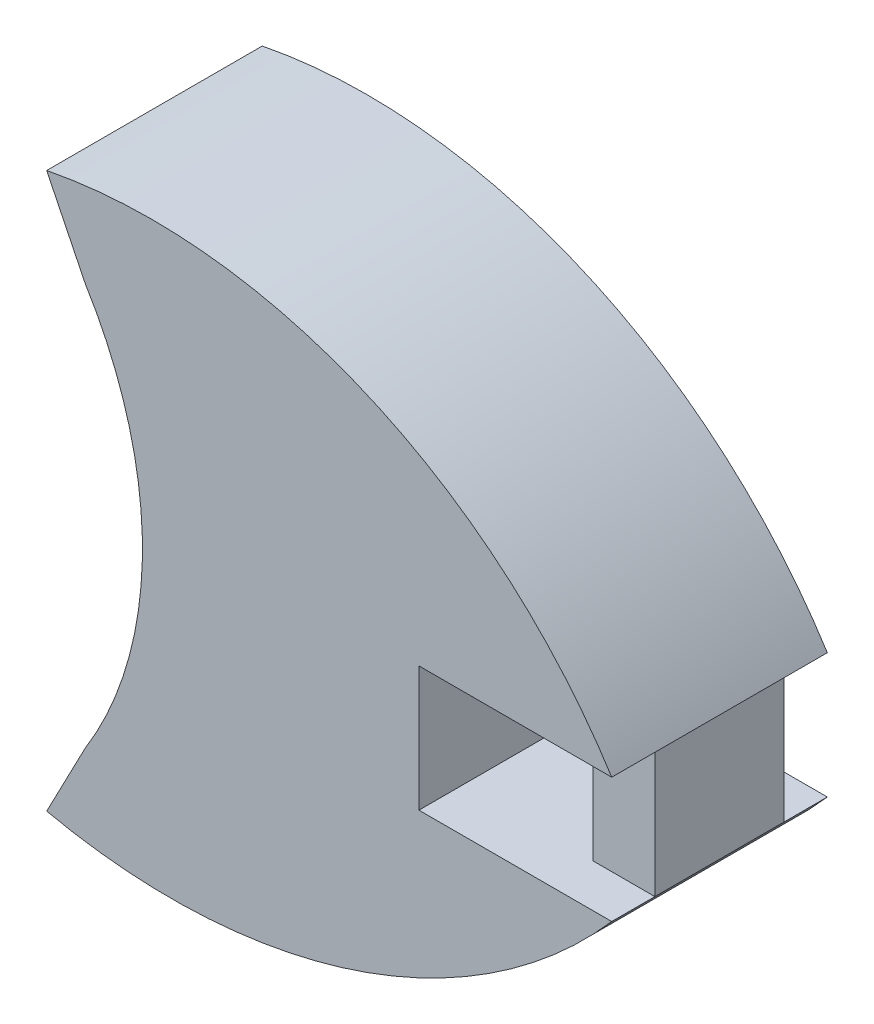
ISO-10303-21;
HEADER;
FILE_DESCRIPTION(('STEP AP214'),'2;1');
FILE_NAME('part.step','',(''),(''),'','','');
FILE_SCHEMA(('AUTOMOTIVE_DESIGN { 1 0 10303 214 1 1 1 1 }'));
ENDSEC;
DATA;
#1=APPLICATION_CONTEXT('core data for automotive mechanical design processes');
#2=APPLICATION_PROTOCOL_DEFINITION('international standard','automotive_design',2000,#1);
#3=PRODUCT_CONTEXT('',#1,'mechanical');
#4=PRODUCT('Part','Part','',(#3));
#5=PRODUCT_RELATED_PRODUCT_CATEGORY('part','',(#4));
#6=PRODUCT_DEFINITION_FORMATION('','',#4);
#7=PRODUCT_DEFINITION_CONTEXT('part definition',#1,'design');
#8=PRODUCT_DEFINITION('design','',#6,#7);
#9=PRODUCT_DEFINITION_SHAPE('','',#8);
#10=(LENGTH_UNIT() NAMED_UNIT(*) SI_UNIT(.MILLI.,.METRE.));
#11=(NAMED_UNIT(*) PLANE_ANGLE_UNIT() SI_UNIT($,.RADIAN.));
#12=(NAMED_UNIT(*) SI_UNIT($,.STERADIAN.) SOLID_ANGLE_UNIT());
#13=UNCERTAINTY_MEASURE_WITH_UNIT(LENGTH_MEASURE(1.E-05),#10,'distance_accuracy_value','');
#14=(GEOMETRIC_REPRESENTATION_CONTEXT(3) GLOBAL_UNCERTAINTY_ASSIGNED_CONTEXT((#13)) GLOBAL_UNIT_ASSIGNED_CONTEXT((#10,
#11,#12)) REPRESENTATION_CONTEXT('',''));
#15=CARTESIAN_POINT('',(0.,0.,0.));
#16=DIRECTION('',(0.,0.,1.));
#17=DIRECTION('',(1.,0.,0.));
#18=AXIS2_PLACEMENT_3D('',#15,#16,#17);
#19=CARTESIAN_POINT('',(0.,0.,10.));
#20=DIRECTION('',(-1.,0.,0.));
#21=DIRECTION('',(0.,0.,1.));
#22=AXIS2_PLACEMENT_3D('',#19,#20,#21);
#23=PLANE('',#22);
#24=DIRECTION('',(0.,-1.,0.));
#25=VECTOR('',#24,1.);
#26=CARTESIAN_POINT('',(0.,0.,2.));
#27=LINE('',#26,#25);
#28=CARTESIAN_POINT('',(0.,0.,2.));
#29=VERTEX_POINT('',#28);
#30=CARTESIAN_POINT('',(0.,-5.79606282895322,2.));
#31=VERTEX_POINT('',#30);
#32=EDGE_CURVE('E215',#29,#31,#27,.T.);
#33=ORIENTED_EDGE('',*,*,#32,.F.);
#34=DIRECTION('',(0.,0.,-1.));
#35=VECTOR('',#34,1.);
#36=CARTESIAN_POINT('',(0.,0.,10.));
#37=LINE('',#36,#35);
#38=CARTESIAN_POINT('',(0.,0.,8.));
#39=VERTEX_POINT('',#38);
#40=EDGE_CURVE('E42',#39,#29,#37,.T.);
#41=ORIENTED_EDGE('',*,*,#40,.F.);
#42=DIRECTION('',(0.,1.,0.));
#43=VECTOR('',#42,1.);
#44=CARTESIAN_POINT('',(0.,0.,8.));
#45=LINE('',#44,#43);
#46=CARTESIAN_POINT('',(0.,-5.79606282895322,8.));
#47=VERTEX_POINT('',#46);
#48=EDGE_CURVE('E232',#47,#39,#45,.T.);
#49=ORIENTED_EDGE('',*,*,#48,.F.);
#50=DIRECTION('',(0.,0.,-1.));
#51=VECTOR('',#50,1.);
#52=CARTESIAN_POINT('',(0.,-5.79606282895322,10.));
#53=LINE('',#52,#51);
#54=EDGE_CURVE('E166',#47,#31,#53,.T.);
#55=ORIENTED_EDGE('',*,*,#54,.T.);
#56=EDGE_LOOP('',(#33,#41,#49,#55));
#57=FACE_BOUND('',#56,.T.);
#58=ADVANCED_FACE('F33',(#57),#23,.F.);
#59=CARTESIAN_POINT('',(-2.8595506181311,0.,10.));
#60=DIRECTION('',(1.,0.,0.));
#61=DIRECTION('',(0.,0.,-1.));
#62=AXIS2_PLACEMENT_3D('',#59,#60,#61);
#63=PLANE('',#62);
#64=DIRECTION('',(0.,1.,0.));
#65=VECTOR('',#64,1.);
#66=CARTESIAN_POINT('',(-2.8595506181311,0.,2.));
#67=LINE('',#66,#65);
#68=CARTESIAN_POINT('',(-2.8595506181311,-5.79606282895322,2.));
#69=VERTEX_POINT('',#68);
#70=CARTESIAN_POINT('',(-2.8595506181311,0.,2.));
#71=VERTEX_POINT('',#70);
#72=EDGE_CURVE('E209',#69,#71,#67,.T.);
#73=ORIENTED_EDGE('',*,*,#72,.F.);
#74=DIRECTION('',(0.,0.,-1.));
#75=VECTOR('',#74,1.);
#76=CARTESIAN_POINT('',(-2.8595506181311,-5.79606282895322,10.));
#77=LINE('',#76,#75);
#78=CARTESIAN_POINT('',(-2.8595506181311,-5.79606282895322,8.));
#79=VERTEX_POINT('',#78);
#80=EDGE_CURVE('E223',#79,#69,#77,.T.);
#81=ORIENTED_EDGE('',*,*,#80,.F.);
#82=DIRECTION('',(0.,-1.,0.));
#83=VECTOR('',#82,1.);
#84=CARTESIAN_POINT('',(-2.8595506181311,0.,8.));
#85=LINE('',#84,#83);
#86=CARTESIAN_POINT('',(-2.8595506181311,0.,8.));
#87=VERTEX_POINT('',#86);
#88=EDGE_CURVE('E244',#87,#79,#85,.T.);
#89=ORIENTED_EDGE('',*,*,#88,.F.);
#90=DIRECTION('',(0.,0.,-1.));
#91=VECTOR('',#90,1.);
#92=CARTESIAN_POINT('',(-2.8595506181311,0.,10.));
#93=LINE('',#92,#91);
#94=EDGE_CURVE('E146',#87,#71,#93,.T.);
#95=ORIENTED_EDGE('',*,*,#94,.T.);
#96=EDGE_LOOP('',(#73,#81,#89,#95));
#97=FACE_BOUND('',#96,.T.);
#98=ADVANCED_FACE('F222',(#97),#63,.F.);
#99=CARTESIAN_POINT('',(0.,0.,10.));
#100=DIRECTION('',(0.,-1.,0.));
#101=DIRECTION('',(0.,0.,-1.));
#102=AXIS2_PLACEMENT_3D('',#99,#100,#101);
#103=PLANE('',#102);
#104=DIRECTION('',(-1.,0.,0.));
#105=VECTOR('',#104,1.);
#106=CARTESIAN_POINT('',(0.,0.,0.));
#107=LINE('',#106,#105);
#108=CARTESIAN_POINT('',(0.,0.,0.));
#109=VERTEX_POINT('',#108);
#110=CARTESIAN_POINT('',(-8.94249693609927,0.,0.));
#111=VERTEX_POINT('',#110);
#112=EDGE_CURVE('E143',#109,#111,#107,.T.);
#113=ORIENTED_EDGE('',*,*,#112,.F.);
#114=DIRECTION('',(0.,0.,-1.));
#115=VECTOR('',#114,1.);
#116=CARTESIAN_POINT('',(0.,0.,2.));
#117=LINE('',#116,#115);
#118=EDGE_CURVE('E203',#29,#109,#117,.T.);
#119=ORIENTED_EDGE('',*,*,#118,.F.);
#120=DIRECTION('',(1.,0.,0.));
#121=VECTOR('',#120,1.);
#122=CARTESIAN_POINT('',(0.,0.,2.));
#123=LINE('',#122,#121);
#124=EDGE_CURVE('E225',#71,#29,#123,.T.);
#125=ORIENTED_EDGE('',*,*,#124,.F.);
#126=ORIENTED_EDGE('',*,*,#94,.F.);
#127=DIRECTION('',(-1.,0.,0.));
#128=VECTOR('',#127,1.);
#129=CARTESIAN_POINT('',(-2.8595506181311,0.,8.));
#130=LINE('',#129,#128);
#131=EDGE_CURVE('E50',#39,#87,#130,.T.);
#132=ORIENTED_EDGE('',*,*,#131,.F.);
#133=CARTESIAN_POINT('',(0.,0.,10.));
#134=VERTEX_POINT('',#133);
#135=EDGE_CURVE('E11',#134,#39,#37,.T.);
#136=ORIENTED_EDGE('',*,*,#135,.F.);
#137=DIRECTION('',(-1.,0.,0.));
#138=VECTOR('',#137,1.);
#139=CARTESIAN_POINT('',(0.,0.,10.));
#140=LINE('',#139,#138);
#141=CARTESIAN_POINT('',(-8.94249693609927,0.,10.));
#142=VERTEX_POINT('',#141);
#143=EDGE_CURVE('E97',#134,#142,#140,.T.);
#144=ORIENTED_EDGE('',*,*,#143,.T.);
#145=DIRECTION('',(0.,0.,-1.));
#146=VECTOR('',#145,1.);
#147=CARTESIAN_POINT('',(-8.94249693609927,0.,10.));
#148=LINE('',#147,#146);
#149=EDGE_CURVE('E37',#142,#111,#148,.T.);
#150=ORIENTED_EDGE('',*,*,#149,.T.);
#151=EDGE_LOOP('',(#113,#119,#125,#126,#132,#136,#144,#150));
#152=FACE_BOUND('',#151,.T.);
#153=ADVANCED_FACE('F35',(#152),#103,.T.);
#154=CARTESIAN_POINT('',(-8.94249693609927,-5.79606282895323,10.));
#155=DIRECTION('',(0.,1.,0.));
#156=DIRECTION('',(0.,0.,1.));
#157=AXIS2_PLACEMENT_3D('',#154,#155,#156);
#158=PLANE('',#157);
#159=DIRECTION('',(1.,0.,0.));
#160=VECTOR('',#159,1.);
#161=CARTESIAN_POINT('',(-8.94249693609927,-5.79606282895323,10.));
#162=LINE('',#161,#160);
#163=CARTESIAN_POINT('',(-8.94249693609927,-5.79606282895323,10.));
#164=VERTEX_POINT('',#163);
#165=CARTESIAN_POINT('',(0.,-5.79606282895322,10.));
#166=VERTEX_POINT('',#165);
#167=EDGE_CURVE('E137',#164,#166,#162,.T.);
#168=ORIENTED_EDGE('',*,*,#167,.T.);
#169=EDGE_CURVE('E164',#166,#47,#53,.T.);
#170=ORIENTED_EDGE('',*,*,#169,.T.);
#171=DIRECTION('',(1.,0.,0.));
#172=VECTOR('',#171,1.);
#173=CARTESIAN_POINT('',(-2.8595506181311,-5.79606282895322,8.));
#174=LINE('',#173,#172);
#175=EDGE_CURVE('E229',#79,#47,#174,.T.);
#176=ORIENTED_EDGE('',*,*,#175,.F.);
#177=ORIENTED_EDGE('',*,*,#80,.T.);
#178=DIRECTION('',(-1.,0.,0.));
#179=VECTOR('',#178,1.);
#180=CARTESIAN_POINT('',(0.,-5.79606282895322,2.));
#181=LINE('',#180,#179);
#182=EDGE_CURVE('E212',#31,#69,#181,.T.);
#183=ORIENTED_EDGE('',*,*,#182,.F.);
#184=DIRECTION('',(0.,0.,-1.));
#185=VECTOR('',#184,1.);
#186=CARTESIAN_POINT('',(0.,-5.79606282895322,2.));
#187=LINE('',#186,#185);
#188=CARTESIAN_POINT('',(0.,-5.79606282895322,0.));
#189=VERTEX_POINT('',#188);
#190=EDGE_CURVE('E251',#31,#189,#187,.T.);
#191=ORIENTED_EDGE('',*,*,#190,.T.);
#192=DIRECTION('',(1.,0.,0.));
#193=VECTOR('',#192,1.);
#194=CARTESIAN_POINT('',(-8.94249693609927,-5.79606282895323,0.));
#195=LINE('',#194,#193);
#196=CARTESIAN_POINT('',(-8.94249693609927,-5.79606282895323,0.));
#197=VERTEX_POINT('',#196);
#198=EDGE_CURVE('E149',#197,#189,#195,.T.);
#199=ORIENTED_EDGE('',*,*,#198,.F.);
#200=DIRECTION('',(0.,0.,-1.));
#201=VECTOR('',#200,1.);
#202=CARTESIAN_POINT('',(-8.94249693609927,-5.79606282895323,10.));
#203=LINE('',#202,#201);
#204=EDGE_CURVE('E167',#164,#197,#203,.T.);
#205=ORIENTED_EDGE('',*,*,#204,.F.);
#206=EDGE_LOOP('',(#168,#170,#176,#177,#183,#191,#199,#205));
#207=FACE_BOUND('',#206,.T.);
#208=ADVANCED_FACE('F227',(#207),#158,.T.);
#209=CARTESIAN_POINT('',(-21.327436511026,-13.495667326703,10.));
#210=DIRECTION('',(0.,0.,-1.));
#211=DIRECTION('',(-1.,0.,0.));
#212=AXIS2_PLACEMENT_3D('',#209,#210,#211);
#213=CYLINDRICAL_SURFACE('',#212,25.2387120258718);
#214=CARTESIAN_POINT('',(-21.327436511026,-13.495667326703,0.));
#215=DIRECTION('',(0.,0.,1.));
#216=DIRECTION('',(1.,0.,0.));
#217=AXIS2_PLACEMENT_3D('',#214,#215,#216);
#218=CIRCLE('',#217,25.2387120258718);
#219=CARTESIAN_POINT('',(-26.2092868313812,11.2664029052976,0.));
#220=VERTEX_POINT('',#219);
#221=EDGE_CURVE('E89',#109,#220,#218,.T.);
#222=ORIENTED_EDGE('',*,*,#221,.T.);
#223=DIRECTION('',(0.,0.,-1.));
#224=VECTOR('',#223,1.);
#225=CARTESIAN_POINT('',(-26.2092868313812,11.2664029052976,10.));
#226=LINE('',#225,#224);
#227=CARTESIAN_POINT('',(-26.2092868313812,11.2664029052976,10.));
#228=VERTEX_POINT('',#227);
#229=EDGE_CURVE('E160',#228,#220,#226,.T.);
#230=ORIENTED_EDGE('',*,*,#229,.F.);
#231=CARTESIAN_POINT('',(-21.327436511026,-13.495667326703,10.));
#232=DIRECTION('',(0.,0.,1.));
#233=DIRECTION('',(1.,0.,0.));
#234=AXIS2_PLACEMENT_3D('',#231,#232,#233);
#235=CIRCLE('',#234,25.2387120258718);
#236=EDGE_CURVE('E59',#134,#228,#235,.T.);
#237=ORIENTED_EDGE('',*,*,#236,.F.);
#238=ORIENTED_EDGE('',*,*,#135,.T.);
#239=ORIENTED_EDGE('',*,*,#40,.T.);
#240=ORIENTED_EDGE('',*,*,#118,.T.);
#241=EDGE_LOOP('',(#222,#230,#237,#238,#239,#240));
#242=FACE_BOUND('',#241,.T.);
#243=ADVANCED_FACE('F255',(#242),#213,.T.);
#244=CARTESIAN_POINT('',(-26.2092868313812,11.2664029052976,10.));
#245=DIRECTION('',(0.898062707987213,0.439867448810064,0.));
#246=DIRECTION('',(-0.439867448810064,0.898062707987213,0.));
#247=AXIS2_PLACEMENT_3D('',#244,#245,#246);
#248=PLANE('',#247);
#249=DIRECTION('',(0.439867448810064,-0.898062707987213,0.));
#250=VECTOR('',#249,1.);
#251=CARTESIAN_POINT('',(-26.2092868313812,11.2664029052976,0.));
#252=LINE('',#251,#250);
#253=CARTESIAN_POINT('',(-24.4189653749276,7.6111632650381,0.));
#254=VERTEX_POINT('',#253);
#255=EDGE_CURVE('E157',#220,#254,#252,.T.);
#256=ORIENTED_EDGE('',*,*,#255,.T.);
#257=DIRECTION('',(0.,0.,-1.));
#258=VECTOR('',#257,1.);
#259=CARTESIAN_POINT('',(-24.4189653749276,7.6111632650381,10.));
#260=LINE('',#259,#258);
#261=CARTESIAN_POINT('',(-24.4189653749276,7.6111632650381,10.));
#262=VERTEX_POINT('',#261);
#263=EDGE_CURVE('E131',#262,#254,#260,.T.);
#264=ORIENTED_EDGE('',*,*,#263,.F.);
#265=DIRECTION('',(0.439867448810064,-0.898062707987213,0.));
#266=VECTOR('',#265,1.);
#267=CARTESIAN_POINT('',(-26.2092868313812,11.2664029052976,10.));
#268=LINE('',#267,#266);
#269=EDGE_CURVE('E118',#228,#262,#268,.T.);
#270=ORIENTED_EDGE('',*,*,#269,.F.);
#271=ORIENTED_EDGE('',*,*,#229,.T.);
#272=EDGE_LOOP('',(#256,#264,#270,#271));
#273=FACE_BOUND('',#272,.T.);
#274=ADVANCED_FACE('F257',(#273),#248,.F.);
#275=CARTESIAN_POINT('',(-39.4875043000791,-1.71342765399132,10.));
#276=DIRECTION('',(0.,0.,-1.));
#277=DIRECTION('',(-1.,0.,0.));
#278=AXIS2_PLACEMENT_3D('',#275,#276,#277);
#279=CYLINDRICAL_SURFACE('',#278,17.7202951766062);
#280=CARTESIAN_POINT('',(-39.4875043000791,-1.71342765399132,0.));
#281=DIRECTION('',(0.,0.,-1.));
#282=DIRECTION('',(-1.,0.,0.));
#283=AXIS2_PLACEMENT_3D('',#280,#281,#282);
#284=CIRCLE('',#283,17.7202951766062);
#285=CARTESIAN_POINT('',(-24.4189653749276,-11.0380185730207,0.));
#286=VERTEX_POINT('',#285);
#287=EDGE_CURVE('E127',#254,#286,#284,.T.);
#288=ORIENTED_EDGE('',*,*,#287,.T.);
#289=DIRECTION('',(0.,0.,-1.));
#290=VECTOR('',#289,1.);
#291=CARTESIAN_POINT('',(-24.4189653749276,-11.0380185730207,10.));
#292=LINE('',#291,#290);
#293=CARTESIAN_POINT('',(-24.4189653749276,-11.0380185730207,10.));
#294=VERTEX_POINT('',#293);
#295=EDGE_CURVE('E124',#294,#286,#292,.T.);
#296=ORIENTED_EDGE('',*,*,#295,.F.);
#297=CARTESIAN_POINT('',(-39.4875043000791,-1.71342765399132,10.));
#298=DIRECTION('',(0.,0.,-1.));
#299=DIRECTION('',(-1.,0.,0.));
#300=AXIS2_PLACEMENT_3D('',#297,#298,#299);
#301=CIRCLE('',#300,17.7202951766062);
#302=EDGE_CURVE('E110',#262,#294,#301,.T.);
#303=ORIENTED_EDGE('',*,*,#302,.F.);
#304=ORIENTED_EDGE('',*,*,#263,.T.);
#305=EDGE_LOOP('',(#288,#296,#303,#304));
#306=FACE_BOUND('',#305,.T.);
#307=ADVANCED_FACE('F125',(#306),#279,.F.);
#308=CARTESIAN_POINT('',(-26.2092868313812,-14.4694680312236,10.));
#309=DIRECTION('',(-0.886584846165455,0.46256600669502,0.));
#310=DIRECTION('',(-0.46256600669502,-0.886584846165455,0.));
#311=AXIS2_PLACEMENT_3D('',#308,#309,#310);
#312=PLANE('',#311);
#313=DIRECTION('',(0.46256600669502,0.886584846165454,0.));
#314=VECTOR('',#313,1.);
#315=CARTESIAN_POINT('',(-26.2092868313812,-14.4694680312236,0.));
#316=LINE('',#315,#314);
#317=CARTESIAN_POINT('',(-26.2092868313812,-14.4694680312236,0.));
#318=VERTEX_POINT('',#317);
#319=EDGE_CURVE('E154',#318,#286,#316,.T.);
#320=ORIENTED_EDGE('',*,*,#319,.F.);
#321=DIRECTION('',(0.,0.,-1.));
#322=VECTOR('',#321,1.);
#323=CARTESIAN_POINT('',(-26.2092868313812,-14.4694680312236,10.));
#324=LINE('',#323,#322);
#325=CARTESIAN_POINT('',(-26.2092868313812,-14.4694680312236,10.));
#326=VERTEX_POINT('',#325);
#327=EDGE_CURVE('E132',#326,#318,#324,.T.);
#328=ORIENTED_EDGE('',*,*,#327,.F.);
#329=DIRECTION('',(0.46256600669502,0.886584846165454,0.));
#330=VECTOR('',#329,1.);
#331=CARTESIAN_POINT('',(-26.2092868313812,-14.4694680312236,10.));
#332=LINE('',#331,#330);
#333=EDGE_CURVE('E115',#326,#294,#332,.T.);
#334=ORIENTED_EDGE('',*,*,#333,.T.);
#335=ORIENTED_EDGE('',*,*,#295,.T.);
#336=EDGE_LOOP('',(#320,#328,#334,#335));
#337=FACE_BOUND('',#336,.T.);
#338=ADVANCED_FACE('F134',(#337),#312,.T.);
#339=CARTESIAN_POINT('',(-20.4409593120349,12.0361063254451,10.));
#340=DIRECTION('',(0.,0.,-1.));
#341=DIRECTION('',(-1.,0.,0.));
#342=AXIS2_PLACEMENT_3D('',#339,#340,#341);
#343=CYLINDRICAL_SURFACE('',#342,27.1259852235332);
#344=CARTESIAN_POINT('',(-20.4409593120349,12.0361063254451,0.));
#345=DIRECTION('',(0.,0.,-1.));
#346=DIRECTION('',(-1.,0.,0.));
#347=AXIS2_PLACEMENT_3D('',#344,#345,#346);
#348=CIRCLE('',#347,27.1259852235332);
#349=EDGE_CURVE('E151',#189,#318,#348,.T.);
#350=ORIENTED_EDGE('',*,*,#349,.F.);
#351=ORIENTED_EDGE('',*,*,#190,.F.);
#352=ORIENTED_EDGE('',*,*,#54,.F.);
#353=ORIENTED_EDGE('',*,*,#169,.F.);
#354=CARTESIAN_POINT('',(-20.4409593120349,12.0361063254451,10.));
#355=DIRECTION('',(0.,0.,-1.));
#356=DIRECTION('',(-1.,0.,0.));
#357=AXIS2_PLACEMENT_3D('',#354,#355,#356);
#358=CIRCLE('',#357,27.1259852235332);
#359=EDGE_CURVE('E135',#166,#326,#358,.T.);
#360=ORIENTED_EDGE('',*,*,#359,.T.);
#361=ORIENTED_EDGE('',*,*,#327,.T.);
#362=EDGE_LOOP('',(#350,#351,#352,#353,#360,#361));
#363=FACE_BOUND('',#362,.T.);
#364=ADVANCED_FACE('F240',(#363),#343,.T.);
#365=CARTESIAN_POINT('',(-8.94249693609927,0.,10.));
#366=DIRECTION('',(1.,0.,0.));
#367=DIRECTION('',(0.,0.,-1.));
#368=AXIS2_PLACEMENT_3D('',#365,#366,#367);
#369=PLANE('',#368);
#370=DIRECTION('',(0.,-1.,0.));
#371=VECTOR('',#370,1.);
#372=CARTESIAN_POINT('',(-8.94249693609927,0.,0.));
#373=LINE('',#372,#371);
#374=EDGE_CURVE('E145',#111,#197,#373,.T.);
#375=ORIENTED_EDGE('',*,*,#374,.F.);
#376=ORIENTED_EDGE('',*,*,#149,.F.);
#377=DIRECTION('',(0.,-1.,0.));
#378=VECTOR('',#377,1.);
#379=CARTESIAN_POINT('',(-8.94249693609927,0.,10.));
#380=LINE('',#379,#378);
#381=EDGE_CURVE('E237',#142,#164,#380,.T.);
#382=ORIENTED_EDGE('',*,*,#381,.T.);
#383=ORIENTED_EDGE('',*,*,#204,.T.);
#384=EDGE_LOOP('',(#375,#376,#382,#383));
#385=FACE_BOUND('',#384,.T.);
#386=ADVANCED_FACE('F177',(#385),#369,.T.);
#387=CARTESIAN_POINT('',(-20.4409593120349,12.0361063254451,10.));
#388=DIRECTION('',(0.,0.,-1.));
#389=DIRECTION('',(-1.,0.,0.));
#390=AXIS2_PLACEMENT_3D('',#387,#388,#389);
#391=PLANE('',#390);
#392=ORIENTED_EDGE('',*,*,#143,.F.);
#393=ORIENTED_EDGE('',*,*,#236,.T.);
#394=ORIENTED_EDGE('',*,*,#269,.T.);
#395=ORIENTED_EDGE('',*,*,#302,.T.);
#396=ORIENTED_EDGE('',*,*,#333,.F.);
#397=ORIENTED_EDGE('',*,*,#359,.F.);
#398=ORIENTED_EDGE('',*,*,#167,.F.);
#399=ORIENTED_EDGE('',*,*,#381,.F.);
#400=EDGE_LOOP('',(#392,#393,#394,#395,#396,#397,#398,#399));
#401=FACE_BOUND('',#400,.T.);
#402=ADVANCED_FACE('F112',(#401),#391,.F.);
#403=CARTESIAN_POINT('',(-20.4409593120349,12.0361063254451,0.));
#404=DIRECTION('',(0.,0.,-1.));
#405=DIRECTION('',(-1.,0.,0.));
#406=AXIS2_PLACEMENT_3D('',#403,#404,#405);
#407=PLANE('',#406);
#408=ORIENTED_EDGE('',*,*,#221,.F.);
#409=ORIENTED_EDGE('',*,*,#112,.T.);
#410=ORIENTED_EDGE('',*,*,#374,.T.);
#411=ORIENTED_EDGE('',*,*,#198,.T.);
#412=ORIENTED_EDGE('',*,*,#349,.T.);
#413=ORIENTED_EDGE('',*,*,#319,.T.);
#414=ORIENTED_EDGE('',*,*,#287,.F.);
#415=ORIENTED_EDGE('',*,*,#255,.F.);
#416=EDGE_LOOP('',(#408,#409,#410,#411,#412,#413,#414,#415));
#417=FACE_BOUND('',#416,.T.);
#418=ADVANCED_FACE('F179',(#417),#407,.T.);
#419=CARTESIAN_POINT('',(0.,0.,8.));
#420=DIRECTION('',(0.,0.,1.));
#421=DIRECTION('',(1.,0.,0.));
#422=AXIS2_PLACEMENT_3D('',#419,#420,#421);
#423=PLANE('',#422);
#424=ORIENTED_EDGE('',*,*,#88,.T.);
#425=ORIENTED_EDGE('',*,*,#175,.T.);
#426=ORIENTED_EDGE('',*,*,#48,.T.);
#427=ORIENTED_EDGE('',*,*,#131,.T.);
#428=EDGE_LOOP('',(#424,#425,#426,#427));
#429=FACE_BOUND('',#428,.T.);
#430=ADVANCED_FACE('F243',(#429),#423,.T.);
#431=CARTESIAN_POINT('',(0.,0.,2.));
#432=DIRECTION('',(0.,0.,-1.));
#433=DIRECTION('',(-1.,0.,0.));
#434=AXIS2_PLACEMENT_3D('',#431,#432,#433);
#435=PLANE('',#434);
#436=ORIENTED_EDGE('',*,*,#32,.T.);
#437=ORIENTED_EDGE('',*,*,#182,.T.);
#438=ORIENTED_EDGE('',*,*,#72,.T.);
#439=ORIENTED_EDGE('',*,*,#124,.T.);
#440=EDGE_LOOP('',(#436,#437,#438,#439));
#441=FACE_BOUND('',#440,.T.);
#442=ADVANCED_FACE('F213',(#441),#435,.T.);
#443=CLOSED_SHELL('',(#58,#98,#153,#208,#243,#274,#307,#338,#364,#386,#402,#418,#430,#442));
#444=MANIFOLD_SOLID_BREP('B2',#443);
#445=ADVANCED_BREP_SHAPE_REPRESENTATION('',(#18,#444),#14);
#446=SHAPE_DEFINITION_REPRESENTATION(#9,#445);
ENDSEC;
END-ISO-10303-21;
